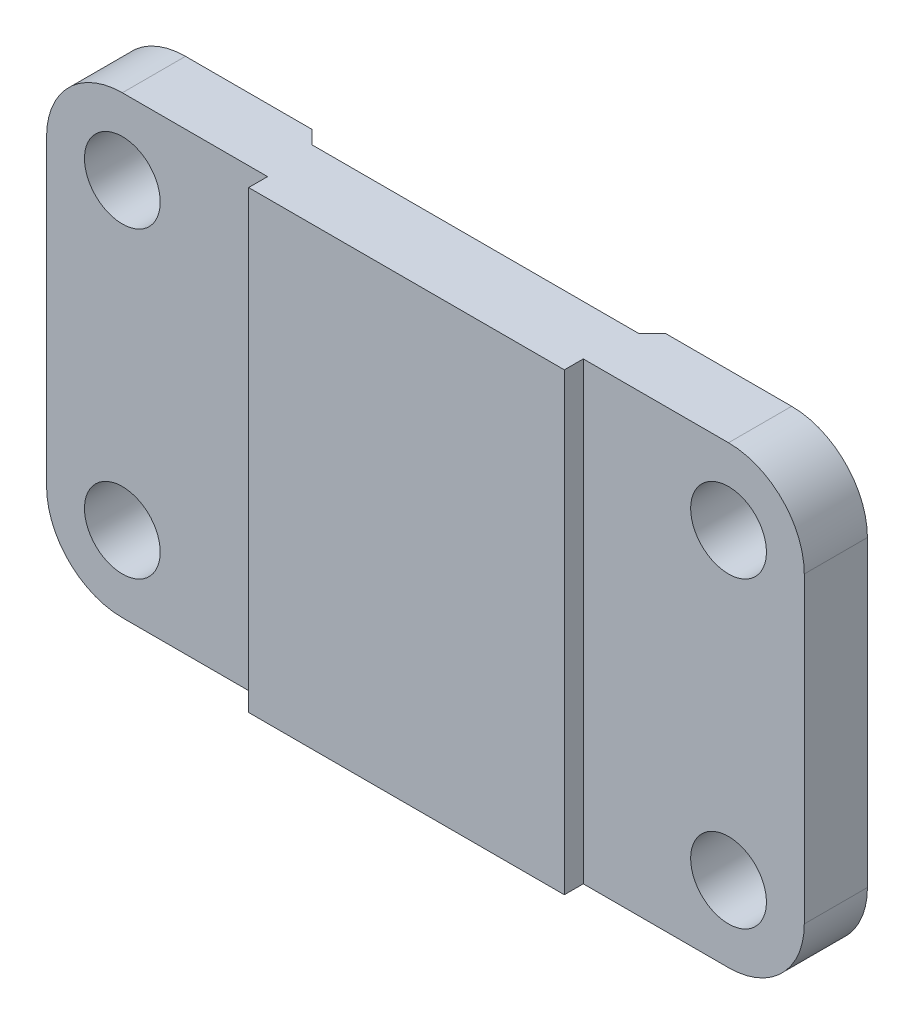
ISO-10303-21;
HEADER;
FILE_DESCRIPTION(('STEP AP214'),'2;1');
FILE_NAME('part.step','',(''),(''),'','','');
FILE_SCHEMA(('AUTOMOTIVE_DESIGN { 1 0 10303 214 1 1 1 1 }'));
ENDSEC;
DATA;
#1=APPLICATION_CONTEXT('core data for automotive mechanical design processes');
#2=APPLICATION_PROTOCOL_DEFINITION('international standard','automotive_design',2000,#1);
#3=PRODUCT_CONTEXT('',#1,'mechanical');
#4=PRODUCT('Part','Part','',(#3));
#5=PRODUCT_RELATED_PRODUCT_CATEGORY('part','',(#4));
#6=PRODUCT_DEFINITION_FORMATION('','',#4);
#7=PRODUCT_DEFINITION_CONTEXT('part definition',#1,'design');
#8=PRODUCT_DEFINITION('design','',#6,#7);
#9=PRODUCT_DEFINITION_SHAPE('','',#8);
#10=(LENGTH_UNIT() NAMED_UNIT(*) SI_UNIT(.MILLI.,.METRE.));
#11=(NAMED_UNIT(*) PLANE_ANGLE_UNIT() SI_UNIT($,.RADIAN.));
#12=(NAMED_UNIT(*) SI_UNIT($,.STERADIAN.) SOLID_ANGLE_UNIT());
#13=UNCERTAINTY_MEASURE_WITH_UNIT(LENGTH_MEASURE(1.E-05),#10,'distance_accuracy_value','');
#14=(GEOMETRIC_REPRESENTATION_CONTEXT(3) GLOBAL_UNCERTAINTY_ASSIGNED_CONTEXT((#13)) GLOBAL_UNIT_ASSIGNED_CONTEXT((#10,
#11,#12)) REPRESENTATION_CONTEXT('',''));
#15=CARTESIAN_POINT('',(0.,0.,0.));
#16=DIRECTION('',(0.,0.,1.));
#17=DIRECTION('',(1.,0.,0.));
#18=AXIS2_PLACEMENT_3D('',#15,#16,#17);
#19=CARTESIAN_POINT('',(-48.,-24.,10.));
#20=DIRECTION('',(0.,0.,1.));
#21=DIRECTION('',(1.,0.,0.));
#22=AXIS2_PLACEMENT_3D('',#19,#20,#21);
#23=PLANE('',#22);
#24=DIRECTION('',(0.,1.,0.));
#25=VECTOR('',#24,1.);
#26=CARTESIAN_POINT('',(25.,36.,10.));
#27=LINE('',#26,#25);
#28=CARTESIAN_POINT('',(25.,-36.,10.));
#29=VERTEX_POINT('',#28);
#30=CARTESIAN_POINT('',(25.,36.,10.));
#31=VERTEX_POINT('',#30);
#32=EDGE_CURVE('E180',#29,#31,#27,.T.);
#33=ORIENTED_EDGE('',*,*,#32,.F.);
#34=DIRECTION('',(1.,0.,0.));
#35=VECTOR('',#34,1.);
#36=CARTESIAN_POINT('',(-47.9999999999999,-36.,10.));
#37=LINE('',#36,#35);
#38=CARTESIAN_POINT('',(47.9999999999999,-36.,10.));
#39=VERTEX_POINT('',#38);
#40=EDGE_CURVE('E260',#29,#39,#37,.T.);
#41=ORIENTED_EDGE('',*,*,#40,.T.);
#42=CARTESIAN_POINT('',(48.,-24.,10.));
#43=DIRECTION('',(0.,0.,1.));
#44=DIRECTION('',(1.,0.,0.));
#45=AXIS2_PLACEMENT_3D('',#42,#43,#44);
#46=CIRCLE('',#45,12.);
#47=CARTESIAN_POINT('',(60.,-23.9999999999999,10.));
#48=VERTEX_POINT('',#47);
#49=EDGE_CURVE('E265',#39,#48,#46,.T.);
#50=ORIENTED_EDGE('',*,*,#49,.T.);
#51=DIRECTION('',(0.,1.,0.));
#52=VECTOR('',#51,1.);
#53=CARTESIAN_POINT('',(60.,23.9999999999999,10.));
#54=LINE('',#53,#52);
#55=CARTESIAN_POINT('',(60.,23.9999999999999,10.));
#56=VERTEX_POINT('',#55);
#57=EDGE_CURVE('E268',#48,#56,#54,.T.);
#58=ORIENTED_EDGE('',*,*,#57,.T.);
#59=CARTESIAN_POINT('',(48.,24.,10.));
#60=DIRECTION('',(0.,0.,1.));
#61=DIRECTION('',(1.,0.,0.));
#62=AXIS2_PLACEMENT_3D('',#59,#60,#61);
#63=CIRCLE('',#62,12.);
#64=CARTESIAN_POINT('',(47.9999999999999,36.,10.));
#65=VERTEX_POINT('',#64);
#66=EDGE_CURVE('E271',#56,#65,#63,.T.);
#67=ORIENTED_EDGE('',*,*,#66,.T.);
#68=DIRECTION('',(-1.,0.,0.));
#69=VECTOR('',#68,1.);
#70=CARTESIAN_POINT('',(-48.,36.,10.));
#71=LINE('',#70,#69);
#72=EDGE_CURVE('E66',#65,#31,#71,.T.);
#73=ORIENTED_EDGE('',*,*,#72,.T.);
#74=EDGE_LOOP('',(#33,#41,#50,#58,#67,#73));
#75=FACE_BOUND('',#74,.T.);
#76=CARTESIAN_POINT('',(48.,-24.,10.));
#77=DIRECTION('',(0.,0.,1.));
#78=DIRECTION('',(-1.,0.,0.));
#79=AXIS2_PLACEMENT_3D('',#76,#77,#78);
#80=CIRCLE('',#79,6.);
#81=CARTESIAN_POINT('',(42.,-24.,10.));
#82=VERTEX_POINT('',#81);
#83=EDGE_CURVE('E233',#82,#82,#80,.T.);
#84=ORIENTED_EDGE('',*,*,#83,.F.);
#85=EDGE_LOOP('',(#84));
#86=FACE_BOUND('',#85,.T.);
#87=CARTESIAN_POINT('',(48.,24.,10.));
#88=DIRECTION('',(0.,0.,1.));
#89=DIRECTION('',(-1.,0.,0.));
#90=AXIS2_PLACEMENT_3D('',#87,#88,#89);
#91=CIRCLE('',#90,6.00000000000001);
#92=CARTESIAN_POINT('',(42.,24.,10.));
#93=VERTEX_POINT('',#92);
#94=EDGE_CURVE('E241',#93,#93,#91,.T.);
#95=ORIENTED_EDGE('',*,*,#94,.F.);
#96=EDGE_LOOP('',(#95));
#97=FACE_BOUND('',#96,.T.);
#98=ADVANCED_FACE('F42',(#75,#86,#97),#23,.T.);
#99=CARTESIAN_POINT('',(-48.,-24.,0.));
#100=DIRECTION('',(0.,0.,1.));
#101=DIRECTION('',(1.,0.,0.));
#102=AXIS2_PLACEMENT_3D('',#99,#100,#101);
#103=PLANE('',#102);
#104=CARTESIAN_POINT('',(-48.,24.,0.));
#105=DIRECTION('',(0.,0.,1.));
#106=DIRECTION('',(1.,0.,0.));
#107=AXIS2_PLACEMENT_3D('',#104,#105,#106);
#108=CIRCLE('',#107,6.00000000000001);
#109=CARTESIAN_POINT('',(-42.,24.,0.));
#110=VERTEX_POINT('',#109);
#111=EDGE_CURVE('E248',#110,#110,#108,.T.);
#112=ORIENTED_EDGE('',*,*,#111,.T.);
#113=EDGE_LOOP('',(#112));
#114=FACE_BOUND('',#113,.T.);
#115=CARTESIAN_POINT('',(-48.,-24.,0.));
#116=DIRECTION('',(0.,0.,1.));
#117=DIRECTION('',(1.,0.,0.));
#118=AXIS2_PLACEMENT_3D('',#115,#116,#117);
#119=CIRCLE('',#118,6.);
#120=CARTESIAN_POINT('',(-42.,-24.,0.));
#121=VERTEX_POINT('',#120);
#122=EDGE_CURVE('E229',#121,#121,#119,.T.);
#123=ORIENTED_EDGE('',*,*,#122,.T.);
#124=EDGE_LOOP('',(#123));
#125=FACE_BOUND('',#124,.T.);
#126=DIRECTION('',(-1.,0.,0.));
#127=VECTOR('',#126,1.);
#128=CARTESIAN_POINT('',(-48.,36.,0.));
#129=LINE('',#128,#127);
#130=CARTESIAN_POINT('',(-28.,36.,0.));
#131=VERTEX_POINT('',#130);
#132=CARTESIAN_POINT('',(-48.,36.,0.));
#133=VERTEX_POINT('',#132);
#134=EDGE_CURVE('E301',#131,#133,#129,.T.);
#135=ORIENTED_EDGE('',*,*,#134,.F.);
#136=DIRECTION('',(0.,-1.,0.));
#137=VECTOR('',#136,1.);
#138=CARTESIAN_POINT('',(-28.,36.,0.));
#139=LINE('',#138,#137);
#140=CARTESIAN_POINT('',(-28.,-36.,0.));
#141=VERTEX_POINT('',#140);
#142=EDGE_CURVE('E203',#131,#141,#139,.T.);
#143=ORIENTED_EDGE('',*,*,#142,.T.);
#144=DIRECTION('',(1.,0.,0.));
#145=VECTOR('',#144,1.);
#146=CARTESIAN_POINT('',(-47.9999999999999,-36.,0.));
#147=LINE('',#146,#145);
#148=CARTESIAN_POINT('',(-47.9999999999999,-36.,0.));
#149=VERTEX_POINT('',#148);
#150=EDGE_CURVE('E288',#149,#141,#147,.T.);
#151=ORIENTED_EDGE('',*,*,#150,.F.);
#152=CARTESIAN_POINT('',(-48.,-24.,0.));
#153=DIRECTION('',(0.,0.,1.));
#154=DIRECTION('',(1.,0.,0.));
#155=AXIS2_PLACEMENT_3D('',#152,#153,#154);
#156=CIRCLE('',#155,12.);
#157=CARTESIAN_POINT('',(-60.,-23.9999999999999,0.));
#158=VERTEX_POINT('',#157);
#159=EDGE_CURVE('E252',#158,#149,#156,.T.);
#160=ORIENTED_EDGE('',*,*,#159,.F.);
#161=DIRECTION('',(0.,-1.,0.));
#162=VECTOR('',#161,1.);
#163=CARTESIAN_POINT('',(-60.,23.9999999999999,0.));
#164=LINE('',#163,#162);
#165=CARTESIAN_POINT('',(-60.,23.9999999999999,0.));
#166=VERTEX_POINT('',#165);
#167=EDGE_CURVE('E261',#166,#158,#164,.T.);
#168=ORIENTED_EDGE('',*,*,#167,.F.);
#169=CARTESIAN_POINT('',(-48.,24.,0.));
#170=DIRECTION('',(0.,0.,1.));
#171=DIRECTION('',(1.,0.,0.));
#172=AXIS2_PLACEMENT_3D('',#169,#170,#171);
#173=CIRCLE('',#172,12.);
#174=EDGE_CURVE('E306',#133,#166,#173,.T.);
#175=ORIENTED_EDGE('',*,*,#174,.F.);
#176=EDGE_LOOP('',(#135,#143,#151,#160,#168,#175));
#177=FACE_BOUND('',#176,.T.);
#178=ADVANCED_FACE('F376',(#114,#125,#177),#103,.F.);
#179=CARTESIAN_POINT('',(-48.,-24.,10.));
#180=DIRECTION('',(0.,0.,-1.));
#181=DIRECTION('',(-1.,0.,0.));
#182=AXIS2_PLACEMENT_3D('',#179,#180,#181);
#183=CYLINDRICAL_SURFACE('',#182,12.);
#184=ORIENTED_EDGE('',*,*,#159,.T.);
#185=DIRECTION('',(0.,0.,-1.));
#186=VECTOR('',#185,1.);
#187=CARTESIAN_POINT('',(-47.9999999999999,-36.,10.));
#188=LINE('',#187,#186);
#189=CARTESIAN_POINT('',(-47.9999999999999,-36.,10.));
#190=VERTEX_POINT('',#189);
#191=EDGE_CURVE('E11',#190,#149,#188,.T.);
#192=ORIENTED_EDGE('',*,*,#191,.F.);
#193=CARTESIAN_POINT('',(-48.,-24.,10.));
#194=DIRECTION('',(0.,0.,1.));
#195=DIRECTION('',(1.,0.,0.));
#196=AXIS2_PLACEMENT_3D('',#193,#194,#195);
#197=CIRCLE('',#196,12.);
#198=CARTESIAN_POINT('',(-60.,-23.9999999999999,10.));
#199=VERTEX_POINT('',#198);
#200=EDGE_CURVE('E256',#199,#190,#197,.T.);
#201=ORIENTED_EDGE('',*,*,#200,.F.);
#202=DIRECTION('',(0.,0.,-1.));
#203=VECTOR('',#202,1.);
#204=CARTESIAN_POINT('',(-60.,-23.9999999999999,10.));
#205=LINE('',#204,#203);
#206=EDGE_CURVE('E283',#199,#158,#205,.T.);
#207=ORIENTED_EDGE('',*,*,#206,.T.);
#208=EDGE_LOOP('',(#184,#192,#201,#207));
#209=FACE_BOUND('',#208,.T.);
#210=ADVANCED_FACE('F44',(#209),#183,.T.);
#211=CARTESIAN_POINT('',(-47.9999999999999,-36.,10.));
#212=DIRECTION('',(0.,1.,0.));
#213=DIRECTION('',(0.,0.,1.));
#214=AXIS2_PLACEMENT_3D('',#211,#212,#213);
#215=PLANE('',#214);
#216=ORIENTED_EDGE('',*,*,#150,.T.);
#217=DIRECTION('',(-0.707106781186546,0.,-0.707106781186549));
#218=VECTOR('',#217,1.);
#219=CARTESIAN_POINT('',(-28.,-36.,0.));
#220=LINE('',#219,#218);
#221=CARTESIAN_POINT('',(-25.8786796564404,-36.,2.12132034355965));
#222=VERTEX_POINT('',#221);
#223=EDGE_CURVE('E182',#222,#141,#220,.T.);
#224=ORIENTED_EDGE('',*,*,#223,.F.);
#225=DIRECTION('',(-1.,0.,0.));
#226=VECTOR('',#225,1.);
#227=CARTESIAN_POINT('',(-25.8786796564404,-36.,2.12132034355965));
#228=LINE('',#227,#226);
#229=CARTESIAN_POINT('',(25.8786796564404,-36.,2.12132034355965));
#230=VERTEX_POINT('',#229);
#231=EDGE_CURVE('E197',#230,#222,#228,.T.);
#232=ORIENTED_EDGE('',*,*,#231,.F.);
#233=DIRECTION('',(-0.707106781186548,0.,0.707106781186547));
#234=VECTOR('',#233,1.);
#235=CARTESIAN_POINT('',(25.8786796564404,-36.,2.12132034355965));
#236=LINE('',#235,#234);
#237=CARTESIAN_POINT('',(28.,-36.,0.));
#238=VERTEX_POINT('',#237);
#239=EDGE_CURVE('E186',#238,#230,#236,.T.);
#240=ORIENTED_EDGE('',*,*,#239,.F.);
#241=CARTESIAN_POINT('',(47.9999999999999,-36.,0.));
#242=VERTEX_POINT('',#241);
#243=EDGE_CURVE('E287',#238,#242,#147,.T.);
#244=ORIENTED_EDGE('',*,*,#243,.T.);
#245=DIRECTION('',(0.,0.,-1.));
#246=VECTOR('',#245,1.);
#247=CARTESIAN_POINT('',(47.9999999999999,-36.,10.));
#248=LINE('',#247,#246);
#249=EDGE_CURVE('E51',#39,#242,#248,.T.);
#250=ORIENTED_EDGE('',*,*,#249,.F.);
#251=ORIENTED_EDGE('',*,*,#40,.F.);
#252=DIRECTION('',(0.,0.,-1.));
#253=VECTOR('',#252,1.);
#254=CARTESIAN_POINT('',(25.,-36.,13.));
#255=LINE('',#254,#253);
#256=CARTESIAN_POINT('',(25.,-36.,13.));
#257=VERTEX_POINT('',#256);
#258=EDGE_CURVE('E400',#257,#29,#255,.T.);
#259=ORIENTED_EDGE('',*,*,#258,.F.);
#260=DIRECTION('',(1.,0.,0.));
#261=VECTOR('',#260,1.);
#262=CARTESIAN_POINT('',(-25.,-36.,13.));
#263=LINE('',#262,#261);
#264=CARTESIAN_POINT('',(-25.,-36.,13.));
#265=VERTEX_POINT('',#264);
#266=EDGE_CURVE('E173',#265,#257,#263,.T.);
#267=ORIENTED_EDGE('',*,*,#266,.F.);
#268=DIRECTION('',(0.,0.,-1.));
#269=VECTOR('',#268,1.);
#270=CARTESIAN_POINT('',(-25.,-36.,13.));
#271=LINE('',#270,#269);
#272=CARTESIAN_POINT('',(-25.,-36.,10.));
#273=VERTEX_POINT('',#272);
#274=EDGE_CURVE('E188',#265,#273,#271,.T.);
#275=ORIENTED_EDGE('',*,*,#274,.T.);
#276=EDGE_CURVE('E262',#190,#273,#37,.T.);
#277=ORIENTED_EDGE('',*,*,#276,.F.);
#278=ORIENTED_EDGE('',*,*,#191,.T.);
#279=EDGE_LOOP('',(#216,#224,#232,#240,#244,#250,#251,#259,#267,#275,#277,#278));
#280=FACE_BOUND('',#279,.T.);
#281=ADVANCED_FACE('F363',(#280),#215,.F.);
#282=CARTESIAN_POINT('',(48.,-24.,10.));
#283=DIRECTION('',(0.,0.,-1.));
#284=DIRECTION('',(-1.,0.,0.));
#285=AXIS2_PLACEMENT_3D('',#282,#283,#284);
#286=CYLINDRICAL_SURFACE('',#285,12.);
#287=CARTESIAN_POINT('',(48.,-24.,0.));
#288=DIRECTION('',(0.,0.,1.));
#289=DIRECTION('',(1.,0.,0.));
#290=AXIS2_PLACEMENT_3D('',#287,#288,#289);
#291=CIRCLE('',#290,12.);
#292=CARTESIAN_POINT('',(60.,-23.9999999999999,0.));
#293=VERTEX_POINT('',#292);
#294=EDGE_CURVE('E292',#242,#293,#291,.T.);
#295=ORIENTED_EDGE('',*,*,#294,.T.);
#296=DIRECTION('',(0.,0.,-1.));
#297=VECTOR('',#296,1.);
#298=CARTESIAN_POINT('',(60.,-23.9999999999999,10.));
#299=LINE('',#298,#297);
#300=EDGE_CURVE('E330',#48,#293,#299,.T.);
#301=ORIENTED_EDGE('',*,*,#300,.F.);
#302=ORIENTED_EDGE('',*,*,#49,.F.);
#303=ORIENTED_EDGE('',*,*,#249,.T.);
#304=EDGE_LOOP('',(#295,#301,#302,#303));
#305=FACE_BOUND('',#304,.T.);
#306=ADVANCED_FACE('F339',(#305),#286,.T.);
#307=CARTESIAN_POINT('',(60.,23.9999999999999,10.));
#308=DIRECTION('',(-1.,0.,0.));
#309=DIRECTION('',(0.,-1.,0.));
#310=AXIS2_PLACEMENT_3D('',#307,#308,#309);
#311=PLANE('',#310);
#312=DIRECTION('',(0.,1.,0.));
#313=VECTOR('',#312,1.);
#314=CARTESIAN_POINT('',(60.,23.9999999999999,0.));
#315=LINE('',#314,#313);
#316=CARTESIAN_POINT('',(60.,23.9999999999999,0.));
#317=VERTEX_POINT('',#316);
#318=EDGE_CURVE('E295',#293,#317,#315,.T.);
#319=ORIENTED_EDGE('',*,*,#318,.T.);
#320=DIRECTION('',(0.,0.,-1.));
#321=VECTOR('',#320,1.);
#322=CARTESIAN_POINT('',(60.,23.9999999999999,10.));
#323=LINE('',#322,#321);
#324=EDGE_CURVE('E326',#56,#317,#323,.T.);
#325=ORIENTED_EDGE('',*,*,#324,.F.);
#326=ORIENTED_EDGE('',*,*,#57,.F.);
#327=ORIENTED_EDGE('',*,*,#300,.T.);
#328=EDGE_LOOP('',(#319,#325,#326,#327));
#329=FACE_BOUND('',#328,.T.);
#330=ADVANCED_FACE('F352',(#329),#311,.F.);
#331=CARTESIAN_POINT('',(48.,24.,10.));
#332=DIRECTION('',(0.,0.,-1.));
#333=DIRECTION('',(-1.,0.,0.));
#334=AXIS2_PLACEMENT_3D('',#331,#332,#333);
#335=CYLINDRICAL_SURFACE('',#334,12.);
#336=CARTESIAN_POINT('',(48.,24.,0.));
#337=DIRECTION('',(0.,0.,1.));
#338=DIRECTION('',(1.,0.,0.));
#339=AXIS2_PLACEMENT_3D('',#336,#337,#338);
#340=CIRCLE('',#339,12.);
#341=CARTESIAN_POINT('',(47.9999999999999,36.,0.));
#342=VERTEX_POINT('',#341);
#343=EDGE_CURVE('E298',#317,#342,#340,.T.);
#344=ORIENTED_EDGE('',*,*,#343,.T.);
#345=DIRECTION('',(0.,0.,-1.));
#346=VECTOR('',#345,1.);
#347=CARTESIAN_POINT('',(47.9999999999999,36.,10.));
#348=LINE('',#347,#346);
#349=EDGE_CURVE('E322',#65,#342,#348,.T.);
#350=ORIENTED_EDGE('',*,*,#349,.F.);
#351=ORIENTED_EDGE('',*,*,#66,.F.);
#352=ORIENTED_EDGE('',*,*,#324,.T.);
#353=EDGE_LOOP('',(#344,#350,#351,#352));
#354=FACE_BOUND('',#353,.T.);
#355=ADVANCED_FACE('F356',(#354),#335,.T.);
#356=CARTESIAN_POINT('',(-48.,36.,10.));
#357=DIRECTION('',(0.,-1.,0.));
#358=DIRECTION('',(0.,0.,-1.));
#359=AXIS2_PLACEMENT_3D('',#356,#357,#358);
#360=PLANE('',#359);
#361=DIRECTION('',(-1.,0.,0.));
#362=VECTOR('',#361,1.);
#363=CARTESIAN_POINT('',(-25.8786796564404,36.,2.12132034355965));
#364=LINE('',#363,#362);
#365=CARTESIAN_POINT('',(25.8786796564404,36.,2.12132034355965));
#366=VERTEX_POINT('',#365);
#367=CARTESIAN_POINT('',(-25.8786796564404,36.,2.12132034355965));
#368=VERTEX_POINT('',#367);
#369=EDGE_CURVE('E201',#366,#368,#364,.T.);
#370=ORIENTED_EDGE('',*,*,#369,.T.);
#371=DIRECTION('',(-0.707106781186546,0.,-0.707106781186549));
#372=VECTOR('',#371,1.);
#373=CARTESIAN_POINT('',(-28.,36.,0.));
#374=LINE('',#373,#372);
#375=EDGE_CURVE('E192',#368,#131,#374,.T.);
#376=ORIENTED_EDGE('',*,*,#375,.T.);
#377=ORIENTED_EDGE('',*,*,#134,.T.);
#378=DIRECTION('',(0.,0.,-1.));
#379=VECTOR('',#378,1.);
#380=CARTESIAN_POINT('',(-48.,36.,10.));
#381=LINE('',#380,#379);
#382=CARTESIAN_POINT('',(-48.,36.,10.));
#383=VERTEX_POINT('',#382);
#384=EDGE_CURVE('E318',#383,#133,#381,.T.);
#385=ORIENTED_EDGE('',*,*,#384,.F.);
#386=CARTESIAN_POINT('',(-25.,36.,10.));
#387=VERTEX_POINT('',#386);
#388=EDGE_CURVE('E274',#387,#383,#71,.T.);
#389=ORIENTED_EDGE('',*,*,#388,.F.);
#390=DIRECTION('',(0.,0.,-1.));
#391=VECTOR('',#390,1.);
#392=CARTESIAN_POINT('',(-25.,36.,13.));
#393=LINE('',#392,#391);
#394=CARTESIAN_POINT('',(-25.,36.,13.));
#395=VERTEX_POINT('',#394);
#396=EDGE_CURVE('E163',#395,#387,#393,.T.);
#397=ORIENTED_EDGE('',*,*,#396,.F.);
#398=DIRECTION('',(-1.,0.,0.));
#399=VECTOR('',#398,1.);
#400=CARTESIAN_POINT('',(-25.,36.,13.));
#401=LINE('',#400,#399);
#402=CARTESIAN_POINT('',(25.,36.,13.));
#403=VERTEX_POINT('',#402);
#404=EDGE_CURVE('E155',#403,#395,#401,.T.);
#405=ORIENTED_EDGE('',*,*,#404,.F.);
#406=DIRECTION('',(0.,0.,-1.));
#407=VECTOR('',#406,1.);
#408=CARTESIAN_POINT('',(25.,36.,13.));
#409=LINE('',#408,#407);
#410=EDGE_CURVE('E160',#403,#31,#409,.T.);
#411=ORIENTED_EDGE('',*,*,#410,.T.);
#412=ORIENTED_EDGE('',*,*,#72,.F.);
#413=ORIENTED_EDGE('',*,*,#349,.T.);
#414=CARTESIAN_POINT('',(28.,36.,0.));
#415=VERTEX_POINT('',#414);
#416=EDGE_CURVE('E302',#342,#415,#129,.T.);
#417=ORIENTED_EDGE('',*,*,#416,.T.);
#418=DIRECTION('',(-0.707106781186548,0.,0.707106781186547));
#419=VECTOR('',#418,1.);
#420=CARTESIAN_POINT('',(25.8786796564404,36.,2.12132034355965));
#421=LINE('',#420,#419);
#422=EDGE_CURVE('E196',#415,#366,#421,.T.);
#423=ORIENTED_EDGE('',*,*,#422,.T.);
#424=EDGE_LOOP('',(#370,#376,#377,#385,#389,#397,#405,#411,#412,#413,#417,#423));
#425=FACE_BOUND('',#424,.T.);
#426=ADVANCED_FACE('F158',(#425),#360,.F.);
#427=CARTESIAN_POINT('',(-48.,24.,10.));
#428=DIRECTION('',(0.,0.,-1.));
#429=DIRECTION('',(-1.,0.,0.));
#430=AXIS2_PLACEMENT_3D('',#427,#428,#429);
#431=CYLINDRICAL_SURFACE('',#430,12.);
#432=ORIENTED_EDGE('',*,*,#174,.T.);
#433=DIRECTION('',(0.,0.,-1.));
#434=VECTOR('',#433,1.);
#435=CARTESIAN_POINT('',(-60.,23.9999999999999,10.));
#436=LINE('',#435,#434);
#437=CARTESIAN_POINT('',(-60.,23.9999999999999,10.));
#438=VERTEX_POINT('',#437);
#439=EDGE_CURVE('E314',#438,#166,#436,.T.);
#440=ORIENTED_EDGE('',*,*,#439,.F.);
#441=CARTESIAN_POINT('',(-48.,24.,10.));
#442=DIRECTION('',(0.,0.,1.));
#443=DIRECTION('',(1.,0.,0.));
#444=AXIS2_PLACEMENT_3D('',#441,#442,#443);
#445=CIRCLE('',#444,12.);
#446=EDGE_CURVE('E277',#383,#438,#445,.T.);
#447=ORIENTED_EDGE('',*,*,#446,.F.);
#448=ORIENTED_EDGE('',*,*,#384,.T.);
#449=EDGE_LOOP('',(#432,#440,#447,#448));
#450=FACE_BOUND('',#449,.T.);
#451=ADVANCED_FACE('F391',(#450),#431,.T.);
#452=CARTESIAN_POINT('',(-60.,23.9999999999999,10.));
#453=DIRECTION('',(1.,0.,0.));
#454=DIRECTION('',(0.,1.,0.));
#455=AXIS2_PLACEMENT_3D('',#452,#453,#454);
#456=PLANE('',#455);
#457=ORIENTED_EDGE('',*,*,#167,.T.);
#458=ORIENTED_EDGE('',*,*,#206,.F.);
#459=DIRECTION('',(0.,-1.,0.));
#460=VECTOR('',#459,1.);
#461=CARTESIAN_POINT('',(-60.,23.9999999999999,10.));
#462=LINE('',#461,#460);
#463=EDGE_CURVE('E280',#438,#199,#462,.T.);
#464=ORIENTED_EDGE('',*,*,#463,.F.);
#465=ORIENTED_EDGE('',*,*,#439,.T.);
#466=EDGE_LOOP('',(#457,#458,#464,#465));
#467=FACE_BOUND('',#466,.T.);
#468=ADVANCED_FACE('F386',(#467),#456,.F.);
#469=DIRECTION('',(0.,-1.,0.));
#470=VECTOR('',#469,1.);
#471=CARTESIAN_POINT('',(-25.,36.,10.));
#472=LINE('',#471,#470);
#473=EDGE_CURVE('E58',#387,#273,#472,.T.);
#474=ORIENTED_EDGE('',*,*,#473,.F.);
#475=ORIENTED_EDGE('',*,*,#388,.T.);
#476=ORIENTED_EDGE('',*,*,#446,.T.);
#477=ORIENTED_EDGE('',*,*,#463,.T.);
#478=ORIENTED_EDGE('',*,*,#200,.T.);
#479=ORIENTED_EDGE('',*,*,#276,.T.);
#480=EDGE_LOOP('',(#474,#475,#476,#477,#478,#479));
#481=FACE_BOUND('',#480,.T.);
#482=CARTESIAN_POINT('',(-48.,-24.,10.));
#483=DIRECTION('',(0.,0.,1.));
#484=DIRECTION('',(1.,0.,0.));
#485=AXIS2_PLACEMENT_3D('',#482,#483,#484);
#486=CIRCLE('',#485,6.);
#487=CARTESIAN_POINT('',(-42.,-24.,10.));
#488=VERTEX_POINT('',#487);
#489=EDGE_CURVE('E224',#488,#488,#486,.T.);
#490=ORIENTED_EDGE('',*,*,#489,.F.);
#491=EDGE_LOOP('',(#490));
#492=FACE_BOUND('',#491,.T.);
#493=CARTESIAN_POINT('',(-48.,24.,10.));
#494=DIRECTION('',(0.,0.,1.));
#495=DIRECTION('',(1.,0.,0.));
#496=AXIS2_PLACEMENT_3D('',#493,#494,#495);
#497=CIRCLE('',#496,6.00000000000001);
#498=CARTESIAN_POINT('',(-42.,24.,10.));
#499=VERTEX_POINT('',#498);
#500=EDGE_CURVE('E228',#499,#499,#497,.T.);
#501=ORIENTED_EDGE('',*,*,#500,.F.);
#502=EDGE_LOOP('',(#501));
#503=FACE_BOUND('',#502,.T.);
#504=ADVANCED_FACE('F419',(#481,#492,#503),#23,.T.);
#505=CARTESIAN_POINT('',(48.,24.,0.));
#506=DIRECTION('',(0.,0.,1.));
#507=DIRECTION('',(-1.,0.,0.));
#508=AXIS2_PLACEMENT_3D('',#505,#506,#507);
#509=CIRCLE('',#508,6.00000000000001);
#510=CARTESIAN_POINT('',(42.,24.,0.));
#511=VERTEX_POINT('',#510);
#512=EDGE_CURVE('E214',#511,#511,#509,.T.);
#513=ORIENTED_EDGE('',*,*,#512,.T.);
#514=EDGE_LOOP('',(#513));
#515=FACE_BOUND('',#514,.T.);
#516=CARTESIAN_POINT('',(48.,-24.,0.));
#517=DIRECTION('',(0.,0.,1.));
#518=DIRECTION('',(-1.,0.,0.));
#519=AXIS2_PLACEMENT_3D('',#516,#517,#518);
#520=CIRCLE('',#519,6.);
#521=CARTESIAN_POINT('',(42.,-24.,0.));
#522=VERTEX_POINT('',#521);
#523=EDGE_CURVE('E237',#522,#522,#520,.T.);
#524=ORIENTED_EDGE('',*,*,#523,.T.);
#525=EDGE_LOOP('',(#524));
#526=FACE_BOUND('',#525,.T.);
#527=ORIENTED_EDGE('',*,*,#243,.F.);
#528=DIRECTION('',(0.,-1.,0.));
#529=VECTOR('',#528,1.);
#530=CARTESIAN_POINT('',(28.,36.,0.));
#531=LINE('',#530,#529);
#532=EDGE_CURVE('E218',#415,#238,#531,.T.);
#533=ORIENTED_EDGE('',*,*,#532,.F.);
#534=ORIENTED_EDGE('',*,*,#416,.F.);
#535=ORIENTED_EDGE('',*,*,#343,.F.);
#536=ORIENTED_EDGE('',*,*,#318,.F.);
#537=ORIENTED_EDGE('',*,*,#294,.F.);
#538=EDGE_LOOP('',(#527,#533,#534,#535,#536,#537));
#539=FACE_BOUND('',#538,.T.);
#540=ADVANCED_FACE('F346',(#515,#526,#539),#103,.F.);
#541=CARTESIAN_POINT('',(-48.,24.,0.));
#542=DIRECTION('',(0.,0.,1.));
#543=DIRECTION('',(1.,0.,0.));
#544=AXIS2_PLACEMENT_3D('',#541,#542,#543);
#545=CYLINDRICAL_SURFACE('',#544,6.00000000000001);
#546=ORIENTED_EDGE('',*,*,#111,.F.);
#547=EDGE_LOOP('',(#546));
#548=FACE_BOUND('',#547,.T.);
#549=ORIENTED_EDGE('',*,*,#500,.T.);
#550=EDGE_LOOP('',(#549));
#551=FACE_BOUND('',#550,.T.);
#552=ADVANCED_FACE('F431',(#548,#551),#545,.F.);
#553=CARTESIAN_POINT('',(-48.,-24.,0.));
#554=DIRECTION('',(0.,0.,1.));
#555=DIRECTION('',(1.,0.,0.));
#556=AXIS2_PLACEMENT_3D('',#553,#554,#555);
#557=CYLINDRICAL_SURFACE('',#556,6.);
#558=ORIENTED_EDGE('',*,*,#122,.F.);
#559=EDGE_LOOP('',(#558));
#560=FACE_BOUND('',#559,.T.);
#561=ORIENTED_EDGE('',*,*,#489,.T.);
#562=EDGE_LOOP('',(#561));
#563=FACE_BOUND('',#562,.T.);
#564=ADVANCED_FACE('F440',(#560,#563),#557,.F.);
#565=CARTESIAN_POINT('',(48.,-24.,0.));
#566=DIRECTION('',(0.,0.,1.));
#567=DIRECTION('',(1.,0.,0.));
#568=AXIS2_PLACEMENT_3D('',#565,#566,#567);
#569=CYLINDRICAL_SURFACE('',#568,6.);
#570=ORIENTED_EDGE('',*,*,#523,.F.);
#571=EDGE_LOOP('',(#570));
#572=FACE_BOUND('',#571,.T.);
#573=ORIENTED_EDGE('',*,*,#83,.T.);
#574=EDGE_LOOP('',(#573));
#575=FACE_BOUND('',#574,.T.);
#576=ADVANCED_FACE('F445',(#572,#575),#569,.F.);
#577=CARTESIAN_POINT('',(48.,24.,0.));
#578=DIRECTION('',(0.,0.,1.));
#579=DIRECTION('',(1.,0.,0.));
#580=AXIS2_PLACEMENT_3D('',#577,#578,#579);
#581=CYLINDRICAL_SURFACE('',#580,6.00000000000001);
#582=ORIENTED_EDGE('',*,*,#512,.F.);
#583=EDGE_LOOP('',(#582));
#584=FACE_BOUND('',#583,.T.);
#585=ORIENTED_EDGE('',*,*,#94,.T.);
#586=EDGE_LOOP('',(#585));
#587=FACE_BOUND('',#586,.T.);
#588=ADVANCED_FACE('F450',(#584,#587),#581,.F.);
#589=CARTESIAN_POINT('',(-28.,36.,0.));
#590=DIRECTION('',(-0.707106781186549,0.,0.707106781186546));
#591=DIRECTION('',(0.707106781186546,0.,0.707106781186549));
#592=AXIS2_PLACEMENT_3D('',#589,#590,#591);
#593=PLANE('',#592);
#594=ORIENTED_EDGE('',*,*,#223,.T.);
#595=ORIENTED_EDGE('',*,*,#142,.F.);
#596=ORIENTED_EDGE('',*,*,#375,.F.);
#597=DIRECTION('',(0.,-1.,0.));
#598=VECTOR('',#597,1.);
#599=CARTESIAN_POINT('',(-25.8786796564404,36.,2.12132034355965));
#600=LINE('',#599,#598);
#601=EDGE_CURVE('E211',#368,#222,#600,.T.);
#602=ORIENTED_EDGE('',*,*,#601,.T.);
#603=EDGE_LOOP('',(#594,#595,#596,#602));
#604=FACE_BOUND('',#603,.T.);
#605=ADVANCED_FACE('F374',(#604),#593,.F.);
#606=CARTESIAN_POINT('',(-25.8786796564404,36.,2.12132034355965));
#607=DIRECTION('',(0.,0.,1.));
#608=DIRECTION('',(1.,0.,0.));
#609=AXIS2_PLACEMENT_3D('',#606,#607,#608);
#610=PLANE('',#609);
#611=ORIENTED_EDGE('',*,*,#231,.T.);
#612=ORIENTED_EDGE('',*,*,#601,.F.);
#613=ORIENTED_EDGE('',*,*,#369,.F.);
#614=DIRECTION('',(0.,-1.,0.));
#615=VECTOR('',#614,1.);
#616=CARTESIAN_POINT('',(25.8786796564404,36.,2.12132034355965));
#617=LINE('',#616,#615);
#618=EDGE_CURVE('E215',#366,#230,#617,.T.);
#619=ORIENTED_EDGE('',*,*,#618,.T.);
#620=EDGE_LOOP('',(#611,#612,#613,#619));
#621=FACE_BOUND('',#620,.T.);
#622=ADVANCED_FACE('F372',(#621),#610,.F.);
#623=CARTESIAN_POINT('',(25.8786796564404,36.,2.12132034355965));
#624=DIRECTION('',(0.707106781186547,0.,0.707106781186548));
#625=DIRECTION('',(0.707106781186548,0.,-0.707106781186547));
#626=AXIS2_PLACEMENT_3D('',#623,#624,#625);
#627=PLANE('',#626);
#628=ORIENTED_EDGE('',*,*,#239,.T.);
#629=ORIENTED_EDGE('',*,*,#618,.F.);
#630=ORIENTED_EDGE('',*,*,#422,.F.);
#631=ORIENTED_EDGE('',*,*,#532,.T.);
#632=EDGE_LOOP('',(#628,#629,#630,#631));
#633=FACE_BOUND('',#632,.T.);
#634=ADVANCED_FACE('F367',(#633),#627,.F.);
#635=CARTESIAN_POINT('',(25.,36.,13.));
#636=DIRECTION('',(-1.,0.,0.));
#637=DIRECTION('',(0.,0.,1.));
#638=AXIS2_PLACEMENT_3D('',#635,#636,#637);
#639=PLANE('',#638);
#640=ORIENTED_EDGE('',*,*,#32,.T.);
#641=ORIENTED_EDGE('',*,*,#410,.F.);
#642=DIRECTION('',(0.,1.,0.));
#643=VECTOR('',#642,1.);
#644=CARTESIAN_POINT('',(25.,36.,13.));
#645=LINE('',#644,#643);
#646=EDGE_CURVE('E168',#257,#403,#645,.T.);
#647=ORIENTED_EDGE('',*,*,#646,.F.);
#648=ORIENTED_EDGE('',*,*,#258,.T.);
#649=EDGE_LOOP('',(#640,#641,#647,#648));
#650=FACE_BOUND('',#649,.T.);
#651=ADVANCED_FACE('F179',(#650),#639,.F.);
#652=CARTESIAN_POINT('',(-25.,36.,13.));
#653=DIRECTION('',(1.,0.,0.));
#654=DIRECTION('',(0.,0.,-1.));
#655=AXIS2_PLACEMENT_3D('',#652,#653,#654);
#656=PLANE('',#655);
#657=ORIENTED_EDGE('',*,*,#473,.T.);
#658=ORIENTED_EDGE('',*,*,#274,.F.);
#659=DIRECTION('',(0.,-1.,0.));
#660=VECTOR('',#659,1.);
#661=CARTESIAN_POINT('',(-25.,36.,13.));
#662=LINE('',#661,#660);
#663=EDGE_CURVE('E167',#395,#265,#662,.T.);
#664=ORIENTED_EDGE('',*,*,#663,.F.);
#665=ORIENTED_EDGE('',*,*,#396,.T.);
#666=EDGE_LOOP('',(#657,#658,#664,#665));
#667=FACE_BOUND('',#666,.T.);
#668=ADVANCED_FACE('F395',(#667),#656,.F.);
#669=CARTESIAN_POINT('',(0.,0.,13.));
#670=DIRECTION('',(0.,0.,1.));
#671=DIRECTION('',(1.,0.,0.));
#672=AXIS2_PLACEMENT_3D('',#669,#670,#671);
#673=PLANE('',#672);
#674=ORIENTED_EDGE('',*,*,#646,.T.);
#675=ORIENTED_EDGE('',*,*,#404,.T.);
#676=ORIENTED_EDGE('',*,*,#663,.T.);
#677=ORIENTED_EDGE('',*,*,#266,.T.);
#678=EDGE_LOOP('',(#674,#675,#676,#677));
#679=FACE_BOUND('',#678,.T.);
#680=ADVANCED_FACE('F171',(#679),#673,.T.);
#681=CLOSED_SHELL('',(#98,#178,#210,#281,#306,#330,#355,#426,#451,#468,#504,#540,#552,#564,#576,
#588,#605,#622,#634,#651,#668,#680));
#682=MANIFOLD_SOLID_BREP('B2',#681);
#683=ADVANCED_BREP_SHAPE_REPRESENTATION('',(#18,#682),#14);
#684=SHAPE_DEFINITION_REPRESENTATION(#9,#683);
ENDSEC;
END-ISO-10303-21;
